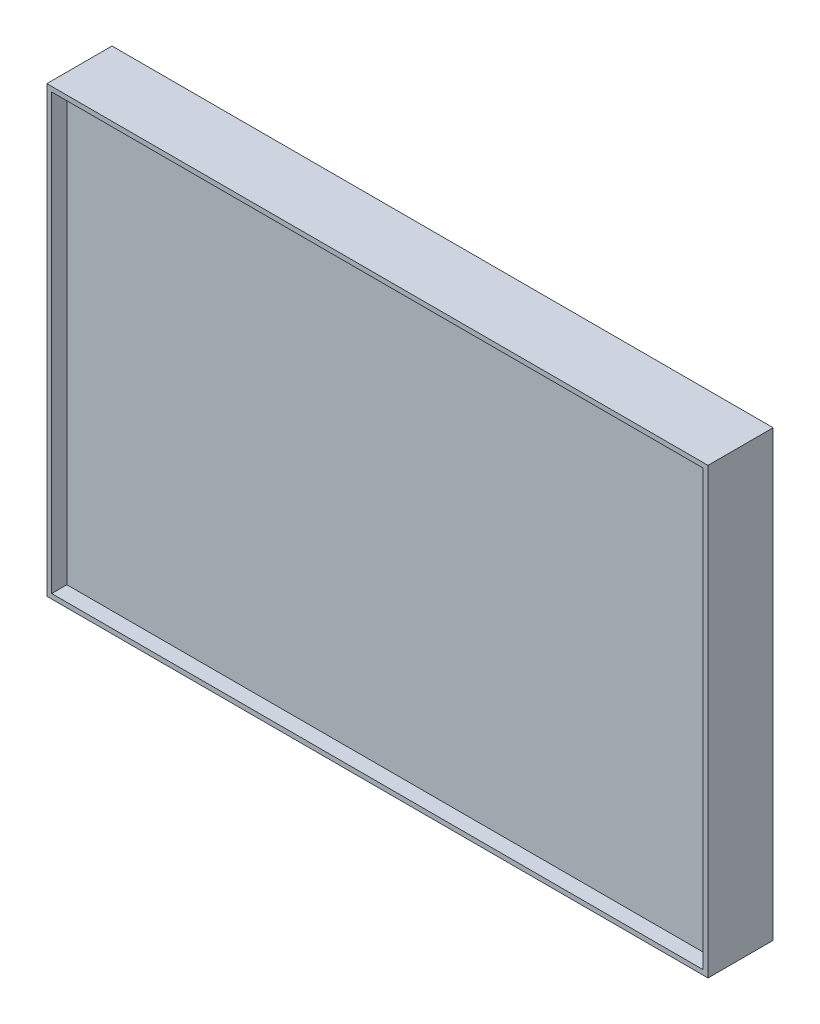
ISO-10303-21;
HEADER;
FILE_DESCRIPTION(('STEP AP214'),'2;1');
FILE_NAME('part.step','',(''),(''),'','','');
FILE_SCHEMA(('AUTOMOTIVE_DESIGN { 1 0 10303 214 1 1 1 1 }'));
ENDSEC;
DATA;
#1=APPLICATION_CONTEXT('core data for automotive mechanical design processes');
#2=APPLICATION_PROTOCOL_DEFINITION('international standard','automotive_design',2000,#1);
#3=PRODUCT_CONTEXT('',#1,'mechanical');
#4=PRODUCT('Part','Part','',(#3));
#5=PRODUCT_RELATED_PRODUCT_CATEGORY('part','',(#4));
#6=PRODUCT_DEFINITION_FORMATION('','',#4);
#7=PRODUCT_DEFINITION_CONTEXT('part definition',#1,'design');
#8=PRODUCT_DEFINITION('design','',#6,#7);
#9=PRODUCT_DEFINITION_SHAPE('','',#8);
#10=(LENGTH_UNIT() NAMED_UNIT(*) SI_UNIT(.MILLI.,.METRE.));
#11=(NAMED_UNIT(*) PLANE_ANGLE_UNIT() SI_UNIT($,.RADIAN.));
#12=(NAMED_UNIT(*) SI_UNIT($,.STERADIAN.) SOLID_ANGLE_UNIT());
#13=UNCERTAINTY_MEASURE_WITH_UNIT(LENGTH_MEASURE(1.E-05),#10,'distance_accuracy_value','');
#14=(GEOMETRIC_REPRESENTATION_CONTEXT(3) GLOBAL_UNCERTAINTY_ASSIGNED_CONTEXT((#13)) GLOBAL_UNIT_ASSIGNED_CONTEXT((#10,
#11,#12)) REPRESENTATION_CONTEXT('',''));
#15=CARTESIAN_POINT('',(0.,0.,0.));
#16=DIRECTION('',(0.,0.,1.));
#17=DIRECTION('',(1.,0.,0.));
#18=AXIS2_PLACEMENT_3D('',#15,#16,#17);
#19=CARTESIAN_POINT('',(-3241.27891156463,1394.34013605442,300.));
#20=DIRECTION('',(1.,0.,0.));
#21=DIRECTION('',(0.,0.,-1.));
#22=AXIS2_PLACEMENT_3D('',#19,#20,#21);
#23=PLANE('',#22);
#24=DIRECTION('',(0.,-1.,0.));
#25=VECTOR('',#24,1.);
#26=CARTESIAN_POINT('',(-3241.27891156463,1394.34013605442,0.));
#27=LINE('',#26,#25);
#28=CARTESIAN_POINT('',(-3241.27891156463,1394.34013605442,0.));
#29=VERTEX_POINT('',#28);
#30=CARTESIAN_POINT('',(-3241.27891156463,-649.659863945578,0.));
#31=VERTEX_POINT('',#30);
#32=EDGE_CURVE('E140',#29,#31,#27,.T.);
#33=ORIENTED_EDGE('',*,*,#32,.T.);
#34=DIRECTION('',(0.,0.,-1.));
#35=VECTOR('',#34,1.);
#36=CARTESIAN_POINT('',(-3241.27891156463,-649.659863945578,300.));
#37=LINE('',#36,#35);
#38=CARTESIAN_POINT('',(-3241.27891156463,-649.659863945578,300.));
#39=VERTEX_POINT('',#38);
#40=EDGE_CURVE('E11',#39,#31,#37,.T.);
#41=ORIENTED_EDGE('',*,*,#40,.F.);
#42=DIRECTION('',(0.,-1.,0.));
#43=VECTOR('',#42,1.);
#44=CARTESIAN_POINT('',(-3241.27891156463,1394.34013605442,300.));
#45=LINE('',#44,#43);
#46=CARTESIAN_POINT('',(-3241.27891156463,1394.34013605442,300.));
#47=VERTEX_POINT('',#46);
#48=EDGE_CURVE('E144',#47,#39,#45,.T.);
#49=ORIENTED_EDGE('',*,*,#48,.F.);
#50=DIRECTION('',(0.,0.,-1.));
#51=VECTOR('',#50,1.);
#52=CARTESIAN_POINT('',(-3241.27891156463,1394.34013605442,300.));
#53=LINE('',#52,#51);
#54=EDGE_CURVE('E150',#47,#29,#53,.T.);
#55=ORIENTED_EDGE('',*,*,#54,.T.);
#56=EDGE_LOOP('',(#33,#41,#49,#55));
#57=FACE_BOUND('',#56,.T.);
#58=ADVANCED_FACE('F32',(#57),#23,.F.);
#59=CARTESIAN_POINT('',(-3241.27891156463,-649.659863945578,300.));
#60=DIRECTION('',(0.,1.,0.));
#61=DIRECTION('',(0.,0.,1.));
#62=AXIS2_PLACEMENT_3D('',#59,#60,#61);
#63=PLANE('',#62);
#64=DIRECTION('',(1.,0.,0.));
#65=VECTOR('',#64,1.);
#66=CARTESIAN_POINT('',(-3241.27891156463,-649.659863945578,0.));
#67=LINE('',#66,#65);
#68=CARTESIAN_POINT('',(-197.278911564626,-649.659863945578,0.));
#69=VERTEX_POINT('',#68);
#70=EDGE_CURVE('E153',#31,#69,#67,.T.);
#71=ORIENTED_EDGE('',*,*,#70,.T.);
#72=DIRECTION('',(0.,0.,-1.));
#73=VECTOR('',#72,1.);
#74=CARTESIAN_POINT('',(-197.278911564626,-649.659863945578,300.));
#75=LINE('',#74,#73);
#76=CARTESIAN_POINT('',(-197.278911564626,-649.659863945578,300.));
#77=VERTEX_POINT('',#76);
#78=EDGE_CURVE('E39',#77,#69,#75,.T.);
#79=ORIENTED_EDGE('',*,*,#78,.F.);
#80=DIRECTION('',(1.,0.,0.));
#81=VECTOR('',#80,1.);
#82=CARTESIAN_POINT('',(-3241.27891156463,-649.659863945578,300.));
#83=LINE('',#82,#81);
#84=EDGE_CURVE('E83',#39,#77,#83,.T.);
#85=ORIENTED_EDGE('',*,*,#84,.F.);
#86=ORIENTED_EDGE('',*,*,#40,.T.);
#87=EDGE_LOOP('',(#71,#79,#85,#86));
#88=FACE_BOUND('',#87,.T.);
#89=ADVANCED_FACE('F182',(#88),#63,.F.);
#90=CARTESIAN_POINT('',(-197.278911564626,1394.34013605442,300.));
#91=DIRECTION('',(-1.,0.,0.));
#92=DIRECTION('',(0.,-1.,0.));
#93=AXIS2_PLACEMENT_3D('',#90,#91,#92);
#94=PLANE('',#93);
#95=DIRECTION('',(0.,1.,0.));
#96=VECTOR('',#95,1.);
#97=CARTESIAN_POINT('',(-197.278911564626,1394.34013605442,0.));
#98=LINE('',#97,#96);
#99=CARTESIAN_POINT('',(-197.278911564626,1394.34013605442,0.));
#100=VERTEX_POINT('',#99);
#101=EDGE_CURVE('E155',#69,#100,#98,.T.);
#102=ORIENTED_EDGE('',*,*,#101,.T.);
#103=DIRECTION('',(0.,0.,-1.));
#104=VECTOR('',#103,1.);
#105=CARTESIAN_POINT('',(-197.278911564626,1394.34013605442,300.));
#106=LINE('',#105,#104);
#107=CARTESIAN_POINT('',(-197.278911564626,1394.34013605442,300.));
#108=VERTEX_POINT('',#107);
#109=EDGE_CURVE('E159',#108,#100,#106,.T.);
#110=ORIENTED_EDGE('',*,*,#109,.F.);
#111=DIRECTION('',(0.,1.,0.));
#112=VECTOR('',#111,1.);
#113=CARTESIAN_POINT('',(-197.278911564626,1394.34013605442,300.));
#114=LINE('',#113,#112);
#115=EDGE_CURVE('E147',#77,#108,#114,.T.);
#116=ORIENTED_EDGE('',*,*,#115,.F.);
#117=ORIENTED_EDGE('',*,*,#78,.T.);
#118=EDGE_LOOP('',(#102,#110,#116,#117));
#119=FACE_BOUND('',#118,.T.);
#120=ADVANCED_FACE('F164',(#119),#94,.F.);
#121=CARTESIAN_POINT('',(-3241.27891156463,1394.34013605442,300.));
#122=DIRECTION('',(0.,-1.,0.));
#123=DIRECTION('',(0.,0.,-1.));
#124=AXIS2_PLACEMENT_3D('',#121,#122,#123);
#125=PLANE('',#124);
#126=DIRECTION('',(-1.,0.,0.));
#127=VECTOR('',#126,1.);
#128=CARTESIAN_POINT('',(-3241.27891156463,1394.34013605442,0.));
#129=LINE('',#128,#127);
#130=EDGE_CURVE('E76',#100,#29,#129,.T.);
#131=ORIENTED_EDGE('',*,*,#130,.T.);
#132=ORIENTED_EDGE('',*,*,#54,.F.);
#133=DIRECTION('',(-1.,0.,0.));
#134=VECTOR('',#133,1.);
#135=CARTESIAN_POINT('',(-3241.27891156463,1394.34013605442,300.));
#136=LINE('',#135,#134);
#137=EDGE_CURVE('E55',#108,#47,#136,.T.);
#138=ORIENTED_EDGE('',*,*,#137,.F.);
#139=ORIENTED_EDGE('',*,*,#109,.T.);
#140=EDGE_LOOP('',(#131,#132,#138,#139));
#141=FACE_BOUND('',#140,.T.);
#142=ADVANCED_FACE('F172',(#141),#125,.F.);
#143=CARTESIAN_POINT('',(0.,0.,300.));
#144=DIRECTION('',(0.,0.,1.));
#145=DIRECTION('',(1.,0.,0.));
#146=AXIS2_PLACEMENT_3D('',#143,#144,#145);
#147=PLANE('',#146);
#148=DIRECTION('',(0.,-1.,0.));
#149=VECTOR('',#148,1.);
#150=CARTESIAN_POINT('',(-3219.27891156463,1372.34013605442,300.));
#151=LINE('',#150,#149);
#152=CARTESIAN_POINT('',(-3219.27891156463,1372.34013605442,300.));
#153=VERTEX_POINT('',#152);
#154=CARTESIAN_POINT('',(-3219.27891156463,-627.659863945578,300.));
#155=VERTEX_POINT('',#154);
#156=EDGE_CURVE('E46',#153,#155,#151,.T.);
#157=ORIENTED_EDGE('',*,*,#156,.F.);
#158=DIRECTION('',(-1.,0.,0.));
#159=VECTOR('',#158,1.);
#160=CARTESIAN_POINT('',(-3219.27891156463,1372.34013605442,300.));
#161=LINE('',#160,#159);
#162=CARTESIAN_POINT('',(-219.278911564626,1372.34013605442,300.));
#163=VERTEX_POINT('',#162);
#164=EDGE_CURVE('E125',#163,#153,#161,.T.);
#165=ORIENTED_EDGE('',*,*,#164,.F.);
#166=DIRECTION('',(0.,1.,0.));
#167=VECTOR('',#166,1.);
#168=CARTESIAN_POINT('',(-219.278911564626,1372.34013605442,300.));
#169=LINE('',#168,#167);
#170=CARTESIAN_POINT('',(-219.278911564625,-627.659863945578,300.));
#171=VERTEX_POINT('',#170);
#172=EDGE_CURVE('E128',#171,#163,#169,.T.);
#173=ORIENTED_EDGE('',*,*,#172,.F.);
#174=DIRECTION('',(1.,0.,0.));
#175=VECTOR('',#174,1.);
#176=CARTESIAN_POINT('',(-3219.27891156463,-627.659863945578,300.));
#177=LINE('',#176,#175);
#178=EDGE_CURVE('E134',#155,#171,#177,.T.);
#179=ORIENTED_EDGE('',*,*,#178,.F.);
#180=EDGE_LOOP('',(#157,#165,#173,#179));
#181=FACE_BOUND('',#180,.T.);
#182=ORIENTED_EDGE('',*,*,#48,.T.);
#183=ORIENTED_EDGE('',*,*,#84,.T.);
#184=ORIENTED_EDGE('',*,*,#115,.T.);
#185=ORIENTED_EDGE('',*,*,#137,.T.);
#186=EDGE_LOOP('',(#182,#183,#184,#185));
#187=FACE_BOUND('',#186,.T.);
#188=ADVANCED_FACE('F174',(#181,#187),#147,.T.);
#189=CARTESIAN_POINT('',(0.,0.,0.));
#190=DIRECTION('',(0.,0.,1.));
#191=DIRECTION('',(1.,0.,0.));
#192=AXIS2_PLACEMENT_3D('',#189,#190,#191);
#193=PLANE('',#192);
#194=ORIENTED_EDGE('',*,*,#32,.F.);
#195=ORIENTED_EDGE('',*,*,#130,.F.);
#196=ORIENTED_EDGE('',*,*,#101,.F.);
#197=ORIENTED_EDGE('',*,*,#70,.F.);
#198=EDGE_LOOP('',(#194,#195,#196,#197));
#199=FACE_BOUND('',#198,.T.);
#200=ADVANCED_FACE('F168',(#199),#193,.F.);
#201=CARTESIAN_POINT('',(-3219.27891156463,1372.34013605442,230.));
#202=DIRECTION('',(-1.,0.,0.));
#203=DIRECTION('',(0.,-1.,0.));
#204=AXIS2_PLACEMENT_3D('',#201,#202,#203);
#205=PLANE('',#204);
#206=ORIENTED_EDGE('',*,*,#156,.T.);
#207=DIRECTION('',(0.,0.,1.));
#208=VECTOR('',#207,1.);
#209=CARTESIAN_POINT('',(-3219.27891156463,-627.659863945578,230.));
#210=LINE('',#209,#208);
#211=CARTESIAN_POINT('',(-3219.27891156463,-627.659863945578,230.));
#212=VERTEX_POINT('',#211);
#213=EDGE_CURVE('E103',#212,#155,#210,.T.);
#214=ORIENTED_EDGE('',*,*,#213,.F.);
#215=DIRECTION('',(0.,-1.,0.));
#216=VECTOR('',#215,1.);
#217=CARTESIAN_POINT('',(-3219.27891156463,1372.34013605442,230.));
#218=LINE('',#217,#216);
#219=CARTESIAN_POINT('',(-3219.27891156463,1372.34013605442,230.));
#220=VERTEX_POINT('',#219);
#221=EDGE_CURVE('E107',#220,#212,#218,.T.);
#222=ORIENTED_EDGE('',*,*,#221,.F.);
#223=DIRECTION('',(0.,0.,1.));
#224=VECTOR('',#223,1.);
#225=CARTESIAN_POINT('',(-3219.27891156463,1372.34013605442,230.));
#226=LINE('',#225,#224);
#227=EDGE_CURVE('E138',#220,#153,#226,.T.);
#228=ORIENTED_EDGE('',*,*,#227,.T.);
#229=EDGE_LOOP('',(#206,#214,#222,#228));
#230=FACE_BOUND('',#229,.T.);
#231=ADVANCED_FACE('F105',(#230),#205,.F.);
#232=CARTESIAN_POINT('',(-3219.27891156463,1372.34013605442,230.));
#233=DIRECTION('',(0.,1.,0.));
#234=DIRECTION('',(-1.,0.,0.));
#235=AXIS2_PLACEMENT_3D('',#232,#233,#234);
#236=PLANE('',#235);
#237=ORIENTED_EDGE('',*,*,#164,.T.);
#238=ORIENTED_EDGE('',*,*,#227,.F.);
#239=DIRECTION('',(-1.,0.,0.));
#240=VECTOR('',#239,1.);
#241=CARTESIAN_POINT('',(-3219.27891156463,1372.34013605442,230.));
#242=LINE('',#241,#240);
#243=CARTESIAN_POINT('',(-219.278911564626,1372.34013605442,230.));
#244=VERTEX_POINT('',#243);
#245=EDGE_CURVE('E113',#244,#220,#242,.T.);
#246=ORIENTED_EDGE('',*,*,#245,.F.);
#247=DIRECTION('',(0.,0.,1.));
#248=VECTOR('',#247,1.);
#249=CARTESIAN_POINT('',(-219.278911564626,1372.34013605442,230.));
#250=LINE('',#249,#248);
#251=EDGE_CURVE('E141',#244,#163,#250,.T.);
#252=ORIENTED_EDGE('',*,*,#251,.T.);
#253=EDGE_LOOP('',(#237,#238,#246,#252));
#254=FACE_BOUND('',#253,.T.);
#255=ADVANCED_FACE('F221',(#254),#236,.F.);
#256=CARTESIAN_POINT('',(-219.278911564626,1372.34013605442,230.));
#257=DIRECTION('',(1.,0.,0.));
#258=DIRECTION('',(0.,1.,0.));
#259=AXIS2_PLACEMENT_3D('',#256,#257,#258);
#260=PLANE('',#259);
#261=ORIENTED_EDGE('',*,*,#172,.T.);
#262=ORIENTED_EDGE('',*,*,#251,.F.);
#263=DIRECTION('',(0.,1.,0.));
#264=VECTOR('',#263,1.);
#265=CARTESIAN_POINT('',(-219.278911564626,1372.34013605442,230.));
#266=LINE('',#265,#264);
#267=CARTESIAN_POINT('',(-219.278911564625,-627.659863945578,230.));
#268=VERTEX_POINT('',#267);
#269=EDGE_CURVE('E121',#268,#244,#266,.T.);
#270=ORIENTED_EDGE('',*,*,#269,.F.);
#271=DIRECTION('',(0.,0.,1.));
#272=VECTOR('',#271,1.);
#273=CARTESIAN_POINT('',(-219.278911564625,-627.659863945578,230.));
#274=LINE('',#273,#272);
#275=EDGE_CURVE('E112',#268,#171,#274,.T.);
#276=ORIENTED_EDGE('',*,*,#275,.T.);
#277=EDGE_LOOP('',(#261,#262,#270,#276));
#278=FACE_BOUND('',#277,.T.);
#279=ADVANCED_FACE('F230',(#278),#260,.F.);
#280=CARTESIAN_POINT('',(-3219.27891156463,-627.659863945578,230.));
#281=DIRECTION('',(0.,-1.,0.));
#282=DIRECTION('',(0.,0.,-1.));
#283=AXIS2_PLACEMENT_3D('',#280,#281,#282);
#284=PLANE('',#283);
#285=ORIENTED_EDGE('',*,*,#178,.T.);
#286=ORIENTED_EDGE('',*,*,#275,.F.);
#287=DIRECTION('',(1.,0.,0.));
#288=VECTOR('',#287,1.);
#289=CARTESIAN_POINT('',(-3219.27891156463,-627.659863945578,230.));
#290=LINE('',#289,#288);
#291=EDGE_CURVE('E116',#212,#268,#290,.T.);
#292=ORIENTED_EDGE('',*,*,#291,.F.);
#293=ORIENTED_EDGE('',*,*,#213,.T.);
#294=EDGE_LOOP('',(#285,#286,#292,#293));
#295=FACE_BOUND('',#294,.T.);
#296=ADVANCED_FACE('F117',(#295),#284,.F.);
#297=CARTESIAN_POINT('',(0.,0.,230.));
#298=DIRECTION('',(0.,0.,1.));
#299=DIRECTION('',(1.,0.,0.));
#300=AXIS2_PLACEMENT_3D('',#297,#298,#299);
#301=PLANE('',#300);
#302=ORIENTED_EDGE('',*,*,#221,.T.);
#303=ORIENTED_EDGE('',*,*,#291,.T.);
#304=ORIENTED_EDGE('',*,*,#269,.T.);
#305=ORIENTED_EDGE('',*,*,#245,.T.);
#306=EDGE_LOOP('',(#302,#303,#304,#305));
#307=FACE_BOUND('',#306,.T.);
#308=ADVANCED_FACE('F123',(#307),#301,.T.);
#309=CLOSED_SHELL('',(#58,#89,#120,#142,#188,#200,#231,#255,#279,#296,#308));
#310=MANIFOLD_SOLID_BREP('B2',#309);
#311=ADVANCED_BREP_SHAPE_REPRESENTATION('',(#18,#310),#14);
#312=SHAPE_DEFINITION_REPRESENTATION(#9,#311);
ENDSEC;
END-ISO-10303-21;
